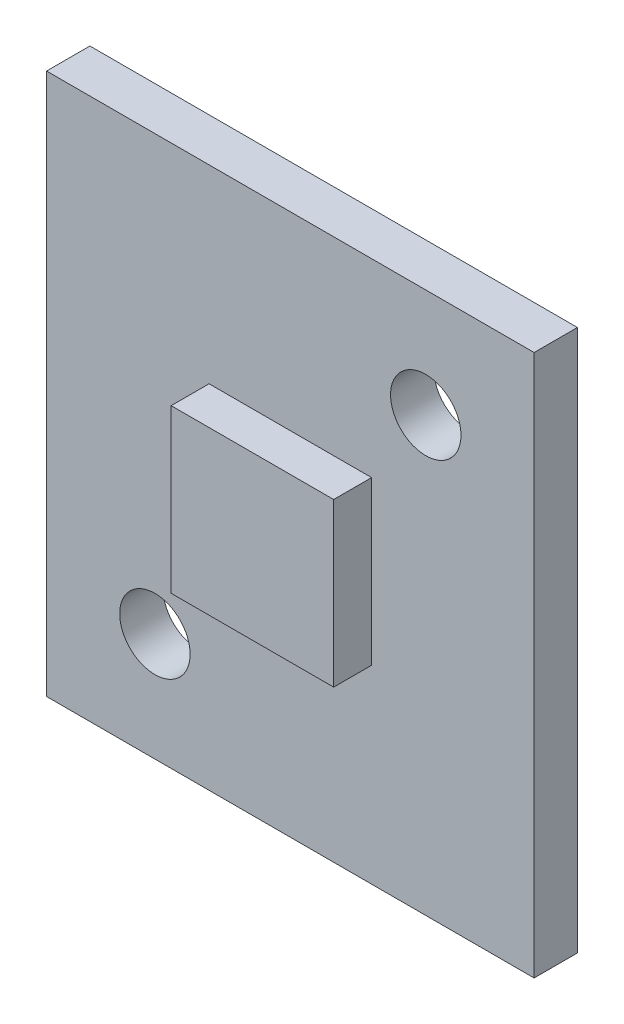
ISO-10303-21;
HEADER;
FILE_DESCRIPTION(('STEP AP214'),'2;1');
FILE_NAME('part.step','',(''),(''),'','','');
FILE_SCHEMA(('AUTOMOTIVE_DESIGN { 1 0 10303 214 1 1 1 1 }'));
ENDSEC;
DATA;
#1=APPLICATION_CONTEXT('core data for automotive mechanical design processes');
#2=APPLICATION_PROTOCOL_DEFINITION('international standard','automotive_design',2000,#1);
#3=PRODUCT_CONTEXT('',#1,'mechanical');
#4=PRODUCT('Part','Part','',(#3));
#5=PRODUCT_RELATED_PRODUCT_CATEGORY('part','',(#4));
#6=PRODUCT_DEFINITION_FORMATION('','',#4);
#7=PRODUCT_DEFINITION_CONTEXT('part definition',#1,'design');
#8=PRODUCT_DEFINITION('design','',#6,#7);
#9=PRODUCT_DEFINITION_SHAPE('','',#8);
#10=(LENGTH_UNIT() NAMED_UNIT(*) SI_UNIT(.MILLI.,.METRE.));
#11=(NAMED_UNIT(*) PLANE_ANGLE_UNIT() SI_UNIT($,.RADIAN.));
#12=(NAMED_UNIT(*) SI_UNIT($,.STERADIAN.) SOLID_ANGLE_UNIT());
#13=UNCERTAINTY_MEASURE_WITH_UNIT(LENGTH_MEASURE(1.E-05),#10,'distance_accuracy_value','');
#14=(GEOMETRIC_REPRESENTATION_CONTEXT(3) GLOBAL_UNCERTAINTY_ASSIGNED_CONTEXT((#13)) GLOBAL_UNIT_ASSIGNED_CONTEXT((#10,
#11,#12)) REPRESENTATION_CONTEXT('',''));
#15=CARTESIAN_POINT('',(0.,0.,0.));
#16=DIRECTION('',(0.,0.,1.));
#17=DIRECTION('',(1.,0.,0.));
#18=AXIS2_PLACEMENT_3D('',#15,#16,#17);
#19=CARTESIAN_POINT('',(0.,0.,39.6));
#20=DIRECTION('',(0.,0.,-1.));
#21=DIRECTION('',(-1.,0.,0.));
#22=AXIS2_PLACEMENT_3D('',#19,#20,#21);
#23=PLANE('',#22);
#24=CARTESIAN_POINT('',(-70.,-66.,39.6));
#25=DIRECTION('',(0.,0.,1.));
#26=DIRECTION('',(1.,0.,0.));
#27=AXIS2_PLACEMENT_3D('',#24,#25,#26);
#28=CIRCLE('',#27,1.3);
#29=CARTESIAN_POINT('',(-68.7,-66.,39.6));
#30=VERTEX_POINT('',#29);
#31=EDGE_CURVE('E270',#30,#30,#28,.T.);
#32=ORIENTED_EDGE('',*,*,#31,.F.);
#33=EDGE_LOOP('',(#32));
#34=FACE_BOUND('',#33,.T.);
#35=CARTESIAN_POINT('',(-60.,-54.,39.6));
#36=DIRECTION('',(0.,0.,1.));
#37=DIRECTION('',(1.,0.,0.));
#38=AXIS2_PLACEMENT_3D('',#35,#36,#37);
#39=CIRCLE('',#38,1.3);
#40=CARTESIAN_POINT('',(-58.7,-54.,39.6));
#41=VERTEX_POINT('',#40);
#42=EDGE_CURVE('E267',#41,#41,#39,.T.);
#43=ORIENTED_EDGE('',*,*,#42,.F.);
#44=EDGE_LOOP('',(#43));
#45=FACE_BOUND('',#44,.T.);
#46=DIRECTION('',(0.,-1.,0.));
#47=VECTOR('',#46,1.);
#48=CARTESIAN_POINT('',(-74.,-70.,39.6));
#49=LINE('',#48,#47);
#50=CARTESIAN_POINT('',(-74.,-50.,39.6));
#51=VERTEX_POINT('',#50);
#52=CARTESIAN_POINT('',(-74.,-70.,39.6));
#53=VERTEX_POINT('',#52);
#54=EDGE_CURVE('E132',#51,#53,#49,.T.);
#55=ORIENTED_EDGE('',*,*,#54,.T.);
#56=DIRECTION('',(1.,0.,0.));
#57=VECTOR('',#56,1.);
#58=CARTESIAN_POINT('',(-74.,-70.,39.6));
#59=LINE('',#58,#57);
#60=CARTESIAN_POINT('',(-56.,-70.,39.6));
#61=VERTEX_POINT('',#60);
#62=EDGE_CURVE('E137',#53,#61,#59,.T.);
#63=ORIENTED_EDGE('',*,*,#62,.T.);
#64=DIRECTION('',(0.,1.,0.));
#65=VECTOR('',#64,1.);
#66=CARTESIAN_POINT('',(-56.,-70.,39.6));
#67=LINE('',#66,#65);
#68=CARTESIAN_POINT('',(-56.,-50.,39.6));
#69=VERTEX_POINT('',#68);
#70=EDGE_CURVE('E142',#61,#69,#67,.T.);
#71=ORIENTED_EDGE('',*,*,#70,.T.);
#72=DIRECTION('',(-1.,0.,0.));
#73=VECTOR('',#72,1.);
#74=CARTESIAN_POINT('',(-74.,-50.,39.6));
#75=LINE('',#74,#73);
#76=EDGE_CURVE('E141',#69,#51,#75,.T.);
#77=ORIENTED_EDGE('',*,*,#76,.T.);
#78=EDGE_LOOP('',(#55,#63,#71,#77));
#79=FACE_BOUND('',#78,.T.);
#80=DIRECTION('',(0.,-1.,0.));
#81=VECTOR('',#80,1.);
#82=CARTESIAN_POINT('',(-68.,-63.,39.6));
#83=LINE('',#82,#81);
#84=CARTESIAN_POINT('',(-68.,-57.,39.6));
#85=VERTEX_POINT('',#84);
#86=CARTESIAN_POINT('',(-68.,-63.,39.6));
#87=VERTEX_POINT('',#86);
#88=EDGE_CURVE('E57',#85,#87,#83,.T.);
#89=ORIENTED_EDGE('',*,*,#88,.F.);
#90=DIRECTION('',(-1.,0.,0.));
#91=VECTOR('',#90,1.);
#92=CARTESIAN_POINT('',(-68.,-57.,39.6));
#93=LINE('',#92,#91);
#94=CARTESIAN_POINT('',(-62.,-57.,39.6));
#95=VERTEX_POINT('',#94);
#96=EDGE_CURVE('E58',#95,#85,#93,.T.);
#97=ORIENTED_EDGE('',*,*,#96,.F.);
#98=DIRECTION('',(0.,1.,0.));
#99=VECTOR('',#98,1.);
#100=CARTESIAN_POINT('',(-62.,-63.,39.6));
#101=LINE('',#100,#99);
#102=CARTESIAN_POINT('',(-62.,-63.,39.6));
#103=VERTEX_POINT('',#102);
#104=EDGE_CURVE('E285',#103,#95,#101,.T.);
#105=ORIENTED_EDGE('',*,*,#104,.F.);
#106=DIRECTION('',(1.,0.,0.));
#107=VECTOR('',#106,1.);
#108=CARTESIAN_POINT('',(-68.,-63.,39.6));
#109=LINE('',#108,#107);
#110=EDGE_CURVE('E284',#87,#103,#109,.T.);
#111=ORIENTED_EDGE('',*,*,#110,.F.);
#112=EDGE_LOOP('',(#89,#97,#105,#111));
#113=FACE_BOUND('',#112,.T.);
#114=ADVANCED_FACE('F41',(#34,#45,#79,#113),#23,.F.);
#115=CARTESIAN_POINT('',(-74.,-70.,39.6));
#116=DIRECTION('',(1.,0.,0.));
#117=DIRECTION('',(0.,0.,-1.));
#118=AXIS2_PLACEMENT_3D('',#115,#116,#117);
#119=PLANE('',#118);
#120=DIRECTION('',(0.,-1.,0.));
#121=VECTOR('',#120,1.);
#122=CARTESIAN_POINT('',(-74.,-70.,38.));
#123=LINE('',#122,#121);
#124=CARTESIAN_POINT('',(-74.,-50.,38.));
#125=VERTEX_POINT('',#124);
#126=CARTESIAN_POINT('',(-74.,-70.,38.));
#127=VERTEX_POINT('',#126);
#128=EDGE_CURVE('E126',#125,#127,#123,.T.);
#129=ORIENTED_EDGE('',*,*,#128,.T.);
#130=DIRECTION('',(0.,0.,-1.));
#131=VECTOR('',#130,1.);
#132=CARTESIAN_POINT('',(-74.,-70.,39.6));
#133=LINE('',#132,#131);
#134=EDGE_CURVE('E11',#53,#127,#133,.T.);
#135=ORIENTED_EDGE('',*,*,#134,.F.);
#136=ORIENTED_EDGE('',*,*,#54,.F.);
#137=DIRECTION('',(0.,0.,-1.));
#138=VECTOR('',#137,1.);
#139=CARTESIAN_POINT('',(-74.,-50.,39.6));
#140=LINE('',#139,#138);
#141=EDGE_CURVE('E144',#51,#125,#140,.T.);
#142=ORIENTED_EDGE('',*,*,#141,.T.);
#143=EDGE_LOOP('',(#129,#135,#136,#142));
#144=FACE_BOUND('',#143,.T.);
#145=ADVANCED_FACE('F43',(#144),#119,.F.);
#146=CARTESIAN_POINT('',(-74.,-70.,39.6));
#147=DIRECTION('',(0.,1.,0.));
#148=DIRECTION('',(0.,0.,1.));
#149=AXIS2_PLACEMENT_3D('',#146,#147,#148);
#150=PLANE('',#149);
#151=DIRECTION('',(1.,0.,0.));
#152=VECTOR('',#151,1.);
#153=CARTESIAN_POINT('',(-74.,-70.,38.));
#154=LINE('',#153,#152);
#155=CARTESIAN_POINT('',(-56.,-70.,38.));
#156=VERTEX_POINT('',#155);
#157=EDGE_CURVE('E128',#127,#156,#154,.T.);
#158=ORIENTED_EDGE('',*,*,#157,.T.);
#159=DIRECTION('',(0.,0.,-1.));
#160=VECTOR('',#159,1.);
#161=CARTESIAN_POINT('',(-56.,-70.,39.6));
#162=LINE('',#161,#160);
#163=EDGE_CURVE('E47',#61,#156,#162,.T.);
#164=ORIENTED_EDGE('',*,*,#163,.F.);
#165=ORIENTED_EDGE('',*,*,#62,.F.);
#166=ORIENTED_EDGE('',*,*,#134,.T.);
#167=EDGE_LOOP('',(#158,#164,#165,#166));
#168=FACE_BOUND('',#167,.T.);
#169=ADVANCED_FACE('F172',(#168),#150,.F.);
#170=CARTESIAN_POINT('',(-56.,-70.,39.6));
#171=DIRECTION('',(-1.,0.,0.));
#172=DIRECTION('',(0.,0.,1.));
#173=AXIS2_PLACEMENT_3D('',#170,#171,#172);
#174=PLANE('',#173);
#175=DIRECTION('',(0.,1.,0.));
#176=VECTOR('',#175,1.);
#177=CARTESIAN_POINT('',(-56.,-70.,38.));
#178=LINE('',#177,#176);
#179=CARTESIAN_POINT('',(-56.,-50.,38.));
#180=VERTEX_POINT('',#179);
#181=EDGE_CURVE('E147',#156,#180,#178,.T.);
#182=ORIENTED_EDGE('',*,*,#181,.T.);
#183=DIRECTION('',(0.,0.,-1.));
#184=VECTOR('',#183,1.);
#185=CARTESIAN_POINT('',(-56.,-50.,39.6));
#186=LINE('',#185,#184);
#187=EDGE_CURVE('E151',#69,#180,#186,.T.);
#188=ORIENTED_EDGE('',*,*,#187,.F.);
#189=ORIENTED_EDGE('',*,*,#70,.F.);
#190=ORIENTED_EDGE('',*,*,#163,.T.);
#191=EDGE_LOOP('',(#182,#188,#189,#190));
#192=FACE_BOUND('',#191,.T.);
#193=ADVANCED_FACE('F158',(#192),#174,.F.);
#194=CARTESIAN_POINT('',(-74.,-50.,39.6));
#195=DIRECTION('',(0.,-1.,0.));
#196=DIRECTION('',(0.,0.,-1.));
#197=AXIS2_PLACEMENT_3D('',#194,#195,#196);
#198=PLANE('',#197);
#199=DIRECTION('',(-1.,0.,0.));
#200=VECTOR('',#199,1.);
#201=CARTESIAN_POINT('',(-74.,-50.,38.));
#202=LINE('',#201,#200);
#203=EDGE_CURVE('E138',#180,#125,#202,.T.);
#204=ORIENTED_EDGE('',*,*,#203,.T.);
#205=ORIENTED_EDGE('',*,*,#141,.F.);
#206=ORIENTED_EDGE('',*,*,#76,.F.);
#207=ORIENTED_EDGE('',*,*,#187,.T.);
#208=EDGE_LOOP('',(#204,#205,#206,#207));
#209=FACE_BOUND('',#208,.T.);
#210=ADVANCED_FACE('F166',(#209),#198,.F.);
#211=CARTESIAN_POINT('',(0.,0.,38.));
#212=DIRECTION('',(0.,0.,-1.));
#213=DIRECTION('',(-1.,0.,0.));
#214=AXIS2_PLACEMENT_3D('',#211,#212,#213);
#215=PLANE('',#214);
#216=CARTESIAN_POINT('',(-70.,-66.,38.));
#217=DIRECTION('',(0.,0.,1.));
#218=DIRECTION('',(1.,0.,0.));
#219=AXIS2_PLACEMENT_3D('',#216,#217,#218);
#220=CIRCLE('',#219,1.3);
#221=CARTESIAN_POINT('',(-68.7,-66.,38.));
#222=VERTEX_POINT('',#221);
#223=EDGE_CURVE('E262',#222,#222,#220,.T.);
#224=ORIENTED_EDGE('',*,*,#223,.T.);
#225=EDGE_LOOP('',(#224));
#226=FACE_BOUND('',#225,.T.);
#227=CARTESIAN_POINT('',(-60.,-54.,38.));
#228=DIRECTION('',(0.,0.,1.));
#229=DIRECTION('',(1.,0.,0.));
#230=AXIS2_PLACEMENT_3D('',#227,#228,#229);
#231=CIRCLE('',#230,1.3);
#232=CARTESIAN_POINT('',(-58.7,-54.,38.));
#233=VERTEX_POINT('',#232);
#234=EDGE_CURVE('E275',#233,#233,#231,.T.);
#235=ORIENTED_EDGE('',*,*,#234,.T.);
#236=EDGE_LOOP('',(#235));
#237=FACE_BOUND('',#236,.T.);
#238=ORIENTED_EDGE('',*,*,#128,.F.);
#239=ORIENTED_EDGE('',*,*,#203,.F.);
#240=ORIENTED_EDGE('',*,*,#181,.F.);
#241=ORIENTED_EDGE('',*,*,#157,.F.);
#242=EDGE_LOOP('',(#238,#239,#240,#241));
#243=FACE_BOUND('',#242,.T.);
#244=ADVANCED_FACE('F164',(#226,#237,#243),#215,.T.);
#245=CARTESIAN_POINT('',(-68.,-63.,41.));
#246=DIRECTION('',(1.,0.,0.));
#247=DIRECTION('',(0.,0.,-1.));
#248=AXIS2_PLACEMENT_3D('',#245,#246,#247);
#249=PLANE('',#248);
#250=ORIENTED_EDGE('',*,*,#88,.T.);
#251=DIRECTION('',(0.,0.,-1.));
#252=VECTOR('',#251,1.);
#253=CARTESIAN_POINT('',(-68.,-63.,41.));
#254=LINE('',#253,#252);
#255=CARTESIAN_POINT('',(-68.,-63.,41.));
#256=VERTEX_POINT('',#255);
#257=EDGE_CURVE('E107',#256,#87,#254,.T.);
#258=ORIENTED_EDGE('',*,*,#257,.F.);
#259=DIRECTION('',(0.,-1.,0.));
#260=VECTOR('',#259,1.);
#261=CARTESIAN_POINT('',(-68.,-63.,41.));
#262=LINE('',#261,#260);
#263=CARTESIAN_POINT('',(-68.,-57.,41.));
#264=VERTEX_POINT('',#263);
#265=EDGE_CURVE('E114',#264,#256,#262,.T.);
#266=ORIENTED_EDGE('',*,*,#265,.F.);
#267=DIRECTION('',(0.,0.,-1.));
#268=VECTOR('',#267,1.);
#269=CARTESIAN_POINT('',(-68.,-57.,41.));
#270=LINE('',#269,#268);
#271=EDGE_CURVE('E278',#264,#85,#270,.T.);
#272=ORIENTED_EDGE('',*,*,#271,.T.);
#273=EDGE_LOOP('',(#250,#258,#266,#272));
#274=FACE_BOUND('',#273,.T.);
#275=ADVANCED_FACE('F123',(#274),#249,.F.);
#276=CARTESIAN_POINT('',(-68.,-63.,41.));
#277=DIRECTION('',(0.,1.,0.));
#278=DIRECTION('',(0.,0.,1.));
#279=AXIS2_PLACEMENT_3D('',#276,#277,#278);
#280=PLANE('',#279);
#281=ORIENTED_EDGE('',*,*,#110,.T.);
#282=DIRECTION('',(0.,0.,-1.));
#283=VECTOR('',#282,1.);
#284=CARTESIAN_POINT('',(-62.,-63.,41.));
#285=LINE('',#284,#283);
#286=CARTESIAN_POINT('',(-62.,-63.,41.));
#287=VERTEX_POINT('',#286);
#288=EDGE_CURVE('E111',#287,#103,#285,.T.);
#289=ORIENTED_EDGE('',*,*,#288,.F.);
#290=DIRECTION('',(1.,0.,0.));
#291=VECTOR('',#290,1.);
#292=CARTESIAN_POINT('',(-68.,-63.,41.));
#293=LINE('',#292,#291);
#294=EDGE_CURVE('E104',#256,#287,#293,.T.);
#295=ORIENTED_EDGE('',*,*,#294,.F.);
#296=ORIENTED_EDGE('',*,*,#257,.T.);
#297=EDGE_LOOP('',(#281,#289,#295,#296));
#298=FACE_BOUND('',#297,.T.);
#299=ADVANCED_FACE('F110',(#298),#280,.F.);
#300=CARTESIAN_POINT('',(-62.,-63.,41.));
#301=DIRECTION('',(-1.,0.,0.));
#302=DIRECTION('',(0.,0.,1.));
#303=AXIS2_PLACEMENT_3D('',#300,#301,#302);
#304=PLANE('',#303);
#305=ORIENTED_EDGE('',*,*,#104,.T.);
#306=DIRECTION('',(0.,0.,-1.));
#307=VECTOR('',#306,1.);
#308=CARTESIAN_POINT('',(-62.,-57.,41.));
#309=LINE('',#308,#307);
#310=CARTESIAN_POINT('',(-62.,-57.,41.));
#311=VERTEX_POINT('',#310);
#312=EDGE_CURVE('E134',#311,#95,#309,.T.);
#313=ORIENTED_EDGE('',*,*,#312,.F.);
#314=DIRECTION('',(0.,1.,0.));
#315=VECTOR('',#314,1.);
#316=CARTESIAN_POINT('',(-62.,-63.,41.));
#317=LINE('',#316,#315);
#318=EDGE_CURVE('E112',#287,#311,#317,.T.);
#319=ORIENTED_EDGE('',*,*,#318,.F.);
#320=ORIENTED_EDGE('',*,*,#288,.T.);
#321=EDGE_LOOP('',(#305,#313,#319,#320));
#322=FACE_BOUND('',#321,.T.);
#323=ADVANCED_FACE('F215',(#322),#304,.F.);
#324=CARTESIAN_POINT('',(-68.,-57.,41.));
#325=DIRECTION('',(0.,-1.,0.));
#326=DIRECTION('',(0.,0.,-1.));
#327=AXIS2_PLACEMENT_3D('',#324,#325,#326);
#328=PLANE('',#327);
#329=ORIENTED_EDGE('',*,*,#96,.T.);
#330=ORIENTED_EDGE('',*,*,#271,.F.);
#331=DIRECTION('',(-1.,0.,0.));
#332=VECTOR('',#331,1.);
#333=CARTESIAN_POINT('',(-68.,-57.,41.));
#334=LINE('',#333,#332);
#335=EDGE_CURVE('E119',#311,#264,#334,.T.);
#336=ORIENTED_EDGE('',*,*,#335,.F.);
#337=ORIENTED_EDGE('',*,*,#312,.T.);
#338=EDGE_LOOP('',(#329,#330,#336,#337));
#339=FACE_BOUND('',#338,.T.);
#340=ADVANCED_FACE('F225',(#339),#328,.F.);
#341=CARTESIAN_POINT('',(0.,0.,41.));
#342=DIRECTION('',(0.,0.,-1.));
#343=DIRECTION('',(-1.,0.,0.));
#344=AXIS2_PLACEMENT_3D('',#341,#342,#343);
#345=PLANE('',#344);
#346=ORIENTED_EDGE('',*,*,#265,.T.);
#347=ORIENTED_EDGE('',*,*,#294,.T.);
#348=ORIENTED_EDGE('',*,*,#318,.T.);
#349=ORIENTED_EDGE('',*,*,#335,.T.);
#350=EDGE_LOOP('',(#346,#347,#348,#349));
#351=FACE_BOUND('',#350,.T.);
#352=ADVANCED_FACE('F117',(#351),#345,.F.);
#353=CARTESIAN_POINT('',(-60.,-54.,38.));
#354=DIRECTION('',(0.,0.,1.));
#355=DIRECTION('',(1.,0.,0.));
#356=AXIS2_PLACEMENT_3D('',#353,#354,#355);
#357=CYLINDRICAL_SURFACE('',#356,1.3);
#358=ORIENTED_EDGE('',*,*,#234,.F.);
#359=EDGE_LOOP('',(#358));
#360=FACE_BOUND('',#359,.T.);
#361=ORIENTED_EDGE('',*,*,#42,.T.);
#362=EDGE_LOOP('',(#361));
#363=FACE_BOUND('',#362,.T.);
#364=ADVANCED_FACE('F240',(#360,#363),#357,.F.);
#365=CARTESIAN_POINT('',(-70.,-66.,38.));
#366=DIRECTION('',(0.,0.,1.));
#367=DIRECTION('',(1.,0.,0.));
#368=AXIS2_PLACEMENT_3D('',#365,#366,#367);
#369=CYLINDRICAL_SURFACE('',#368,1.3);
#370=ORIENTED_EDGE('',*,*,#223,.F.);
#371=EDGE_LOOP('',(#370));
#372=FACE_BOUND('',#371,.T.);
#373=ORIENTED_EDGE('',*,*,#31,.T.);
#374=EDGE_LOOP('',(#373));
#375=FACE_BOUND('',#374,.T.);
#376=ADVANCED_FACE('F248',(#372,#375),#369,.F.);
#377=CLOSED_SHELL('',(#114,#145,#169,#193,#210,#244,#275,#299,#323,#340,#352,#364,#376));
#378=MANIFOLD_SOLID_BREP('B2',#377);
#379=ADVANCED_BREP_SHAPE_REPRESENTATION('',(#18,#378),#14);
#380=SHAPE_DEFINITION_REPRESENTATION(#9,#379);
ENDSEC;
END-ISO-10303-21;
